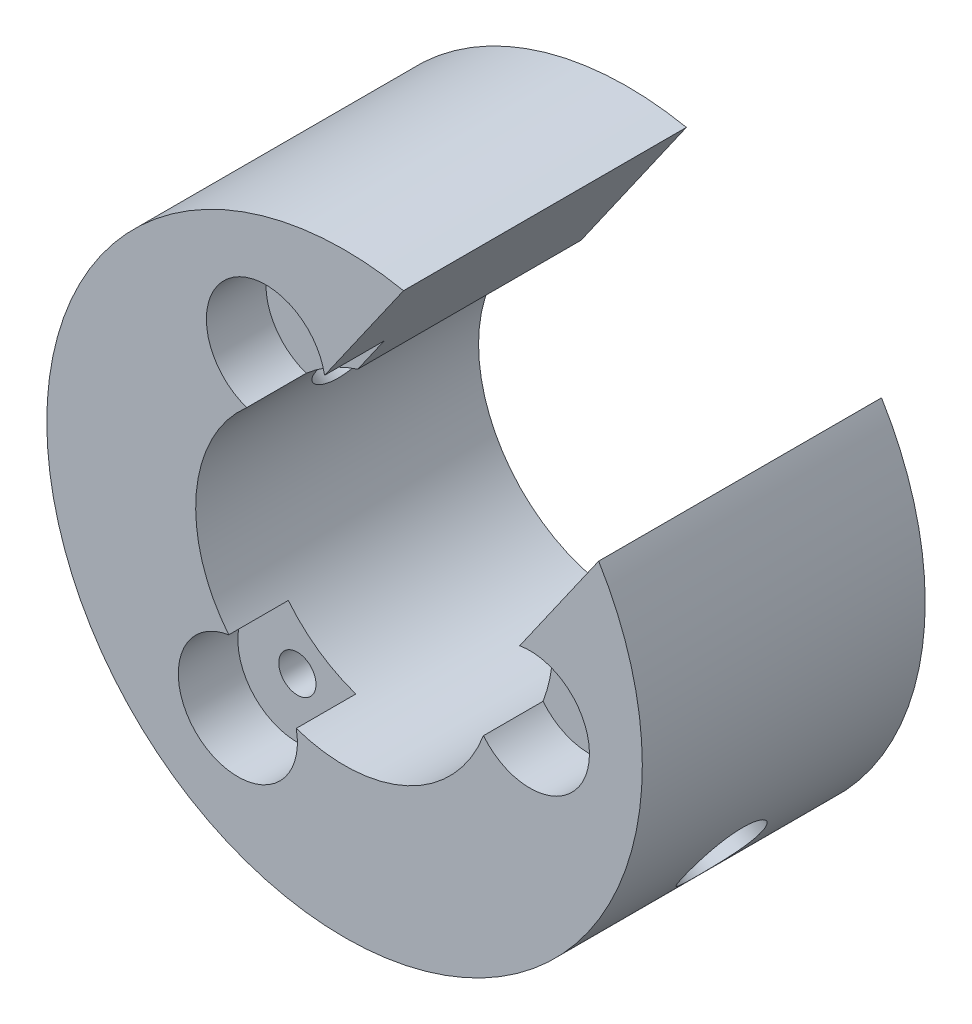
ISO-10303-21;
HEADER;
FILE_DESCRIPTION(('STEP AP214'),'2;1');
FILE_NAME('part.step','',(''),(''),'','','');
FILE_SCHEMA(('AUTOMOTIVE_DESIGN { 1 0 10303 214 1 1 1 1 }'));
ENDSEC;
DATA;
#1=APPLICATION_CONTEXT('core data for automotive mechanical design processes');
#2=APPLICATION_PROTOCOL_DEFINITION('international standard','automotive_design',2000,#1);
#3=PRODUCT_CONTEXT('',#1,'mechanical');
#4=PRODUCT('Part','Part','',(#3));
#5=PRODUCT_RELATED_PRODUCT_CATEGORY('part','',(#4));
#6=PRODUCT_DEFINITION_FORMATION('','',#4);
#7=PRODUCT_DEFINITION_CONTEXT('part definition',#1,'design');
#8=PRODUCT_DEFINITION('design','',#6,#7);
#9=PRODUCT_DEFINITION_SHAPE('','',#8);
#10=(LENGTH_UNIT() NAMED_UNIT(*) SI_UNIT(.MILLI.,.METRE.));
#11=(NAMED_UNIT(*) PLANE_ANGLE_UNIT() SI_UNIT($,.RADIAN.));
#12=(NAMED_UNIT(*) SI_UNIT($,.STERADIAN.) SOLID_ANGLE_UNIT());
#13=UNCERTAINTY_MEASURE_WITH_UNIT(LENGTH_MEASURE(1.E-05),#10,'distance_accuracy_value','');
#14=(GEOMETRIC_REPRESENTATION_CONTEXT(3) GLOBAL_UNCERTAINTY_ASSIGNED_CONTEXT((#13)) GLOBAL_UNIT_ASSIGNED_CONTEXT((#10,
#11,#12)) REPRESENTATION_CONTEXT('',''));
#15=CARTESIAN_POINT('',(0.,0.,0.));
#16=DIRECTION('',(0.,0.,1.));
#17=DIRECTION('',(1.,0.,0.));
#18=AXIS2_PLACEMENT_3D('',#15,#16,#17);
#19=CARTESIAN_POINT('',(-11.1146575850265,3.6588518709451,9.5));
#20=DIRECTION('',(0.,0.,-1.));
#21=DIRECTION('',(-1.,0.,0.));
#22=AXIS2_PLACEMENT_3D('',#19,#20,#21);
#23=CYLINDRICAL_SURFACE('',#22,0.625000000000001);
#24=CARTESIAN_POINT('',(-11.1146575850265,3.6588518709451,0.));
#25=DIRECTION('',(0.,0.,1.));
#26=DIRECTION('',(1.,0.,0.));
#27=AXIS2_PLACEMENT_3D('',#24,#25,#26);
#28=CIRCLE('',#27,0.625000000000001);
#29=CARTESIAN_POINT('',(-10.4896575850265,3.6588518709451,0.));
#30=VERTEX_POINT('',#29);
#31=EDGE_CURVE('E143',#30,#30,#28,.T.);
#32=ORIENTED_EDGE('',*,*,#31,.F.);
#33=EDGE_LOOP('',(#32));
#34=FACE_BOUND('',#33,.T.);
#35=CARTESIAN_POINT('',(-11.1146575850265,3.6588518709451,7.5));
#36=DIRECTION('',(0.,0.,1.));
#37=DIRECTION('',(1.,0.,0.));
#38=AXIS2_PLACEMENT_3D('',#35,#36,#37);
#39=CIRCLE('',#38,0.625000000000001);
#40=CARTESIAN_POINT('',(-10.4896575850265,3.6588518709451,7.5));
#41=VERTEX_POINT('',#40);
#42=EDGE_CURVE('E232',#41,#41,#39,.T.);
#43=ORIENTED_EDGE('',*,*,#42,.T.);
#44=EDGE_LOOP('',(#43));
#45=FACE_BOUND('',#44,.T.);
#46=ADVANCED_FACE('F36',(#34,#45),#23,.F.);
#47=CARTESIAN_POINT('',(-2.24934668680939,-2.54870564855913,9.5));
#48=DIRECTION('',(0.,0.,-1.));
#49=DIRECTION('',(-1.,0.,0.));
#50=AXIS2_PLACEMENT_3D('',#47,#48,#49);
#51=CYLINDRICAL_SURFACE('',#50,0.625);
#52=CARTESIAN_POINT('',(-2.24934668680939,-2.54870564855913,0.));
#53=DIRECTION('',(0.,0.,1.));
#54=DIRECTION('',(1.,0.,0.));
#55=AXIS2_PLACEMENT_3D('',#52,#53,#54);
#56=CIRCLE('',#55,0.625);
#57=CARTESIAN_POINT('',(-1.62434668680939,-2.54870564855913,0.));
#58=VERTEX_POINT('',#57);
#59=EDGE_CURVE('E217',#58,#58,#56,.T.);
#60=ORIENTED_EDGE('',*,*,#59,.F.);
#61=EDGE_LOOP('',(#60));
#62=FACE_BOUND('',#61,.T.);
#63=CARTESIAN_POINT('',(-2.24934668680939,-2.54870564855913,7.5));
#64=DIRECTION('',(0.,0.,1.));
#65=DIRECTION('',(1.,0.,0.));
#66=AXIS2_PLACEMENT_3D('',#63,#64,#65);
#67=CIRCLE('',#66,0.625);
#68=CARTESIAN_POINT('',(-1.62434668680939,-2.54870564855913,7.5));
#69=VERTEX_POINT('',#68);
#70=EDGE_CURVE('E242',#69,#69,#67,.T.);
#71=ORIENTED_EDGE('',*,*,#70,.T.);
#72=EDGE_LOOP('',(#71));
#73=FACE_BOUND('',#72,.T.);
#74=ADVANCED_FACE('F228',(#62,#73),#51,.F.);
#75=CARTESIAN_POINT('',(-12.0579046432617,-7.12251133911001,9.5));
#76=DIRECTION('',(0.,0.,-1.));
#77=DIRECTION('',(-1.,0.,0.));
#78=AXIS2_PLACEMENT_3D('',#75,#76,#77);
#79=CYLINDRICAL_SURFACE('',#78,0.625000000000001);
#80=CARTESIAN_POINT('',(-12.0579046432617,-7.12251133911001,0.));
#81=DIRECTION('',(0.,0.,1.));
#82=DIRECTION('',(1.,0.,0.));
#83=AXIS2_PLACEMENT_3D('',#80,#81,#82);
#84=CIRCLE('',#83,0.625000000000001);
#85=CARTESIAN_POINT('',(-11.4329046432617,-7.12251133911001,0.));
#86=VERTEX_POINT('',#85);
#87=EDGE_CURVE('E215',#86,#86,#84,.T.);
#88=ORIENTED_EDGE('',*,*,#87,.F.);
#89=EDGE_LOOP('',(#88));
#90=FACE_BOUND('',#89,.T.);
#91=CARTESIAN_POINT('',(-12.0579046432617,-7.12251133911001,7.5));
#92=DIRECTION('',(0.,0.,1.));
#93=DIRECTION('',(1.,0.,0.));
#94=AXIS2_PLACEMENT_3D('',#91,#92,#93);
#95=CIRCLE('',#94,0.625000000000001);
#96=CARTESIAN_POINT('',(-11.4329046432617,-7.12251133911001,7.5));
#97=VERTEX_POINT('',#96);
#98=EDGE_CURVE('E258',#97,#97,#95,.T.);
#99=ORIENTED_EDGE('',*,*,#98,.T.);
#100=EDGE_LOOP('',(#99));
#101=FACE_BOUND('',#100,.T.);
#102=ADVANCED_FACE('F195',(#90,#101),#79,.F.);
#103=CARTESIAN_POINT('',(-8.47396963836586,-2.00412170557468,9.5));
#104=DIRECTION('',(0.,0.,1.));
#105=DIRECTION('',(1.,0.,0.));
#106=AXIS2_PLACEMENT_3D('',#103,#104,#105);
#107=PLANE('',#106);
#108=CARTESIAN_POINT('',(-11.1146575850265,3.6588518709451,9.5));
#109=DIRECTION('',(0.,0.,1.));
#110=DIRECTION('',(1.,0.,0.));
#111=AXIS2_PLACEMENT_3D('',#108,#109,#110);
#112=CIRCLE('',#111,2.);
#113=CARTESIAN_POINT('',(-9.14576767615636,4.01023844830594,9.5));
#114=VERTEX_POINT('',#113);
#115=CARTESIAN_POINT('',(-11.7588478901553,1.76543727007764,9.5));
#116=VERTEX_POINT('',#115);
#117=EDGE_CURVE('E254',#114,#116,#112,.T.);
#118=ORIENTED_EDGE('',*,*,#117,.F.);
#119=DIRECTION('',(0.573576436351047,0.819152044288991,0.));
#120=VECTOR('',#119,1.);
#121=CARTESIAN_POINT('',(-10.0298485064687,2.74764017269648,9.5));
#122=LINE('',#121,#120);
#123=CARTESIAN_POINT('',(-6.49366294267844,7.79783653709375,9.5));
#124=VERTEX_POINT('',#123);
#125=EDGE_CURVE('E136',#114,#124,#122,.T.);
#126=ORIENTED_EDGE('',*,*,#125,.T.);
#127=CARTESIAN_POINT('',(-8.47396963836586,-2.00412170557468,9.5));
#128=DIRECTION('',(0.,0.,1.));
#129=DIRECTION('',(1.,0.,0.));
#130=AXIS2_PLACEMENT_3D('',#127,#128,#129);
#131=CIRCLE('',#130,10.);
#132=CARTESIAN_POINT('',(0.0595534116334959,3.20922504628537,9.5));
#133=VERTEX_POINT('',#132);
#134=EDGE_CURVE('E139',#124,#133,#131,.T.);
#135=ORIENTED_EDGE('',*,*,#134,.T.);
#136=DIRECTION('',(-0.573576436351048,-0.819152044288991,0.));
#137=VECTOR('',#136,1.);
#138=CARTESIAN_POINT('',(-3.47663215215675,-1.84097131811189,9.5));
#139=LINE('',#138,#137);
#140=CARTESIAN_POINT('',(-2.59255132184436,-0.578373042502342,9.5));
#141=VERTEX_POINT('',#140);
#142=EDGE_CURVE('E147',#133,#141,#139,.T.);
#143=ORIENTED_EDGE('',*,*,#142,.T.);
#144=CARTESIAN_POINT('',(-2.24934668680939,-2.54870564855913,9.5));
#145=DIRECTION('',(0.,0.,1.));
#146=DIRECTION('',(1.,0.,0.));
#147=AXIS2_PLACEMENT_3D('',#144,#145,#146);
#148=CIRCLE('',#147,2.);
#149=CARTESIAN_POINT('',(-3.80824835484368,-3.80163245783408,9.5));
#150=VERTEX_POINT('',#149);
#151=EDGE_CURVE('E135',#150,#141,#148,.T.);
#152=ORIENTED_EDGE('',*,*,#151,.F.);
#153=CARTESIAN_POINT('',(-8.47396963836586,-2.00412170557468,9.5));
#154=DIRECTION('',(0.,0.,-1.));
#155=DIRECTION('',(1.,0.,0.));
#156=AXIS2_PLACEMENT_3D('',#153,#154,#155);
#157=CIRCLE('',#156,5.);
#158=CARTESIAN_POINT('',(-10.0960643464498,-6.73368920778947,9.5));
#159=VERTEX_POINT('',#158);
#160=EDGE_CURVE('E128',#150,#159,#157,.T.);
#161=ORIENTED_EDGE('',*,*,#160,.T.);
#162=CARTESIAN_POINT('',(-12.0579046432617,-7.12251133911001,9.5));
#163=DIRECTION('',(0.,0.,1.));
#164=DIRECTION('',(1.,0.,0.));
#165=AXIS2_PLACEMENT_3D('',#162,#163,#164);
#166=CIRCLE('',#165,2.);
#167=CARTESIAN_POINT('',(-12.3635202551593,-5.1459994879529,9.5));
#168=VERTEX_POINT('',#167);
#169=EDGE_CURVE('E114',#168,#159,#166,.T.);
#170=ORIENTED_EDGE('',*,*,#169,.F.);
#171=EDGE_CURVE('E137',#168,#116,#157,.T.);
#172=ORIENTED_EDGE('',*,*,#171,.T.);
#173=EDGE_LOOP('',(#118,#126,#135,#143,#152,#161,#170,#172));
#174=FACE_BOUND('',#173,.T.);
#175=ADVANCED_FACE('F133',(#174),#107,.T.);
#176=CARTESIAN_POINT('',(-8.47396963836586,-2.00412170557468,0.));
#177=DIRECTION('',(0.,0.,1.));
#178=DIRECTION('',(1.,0.,0.));
#179=AXIS2_PLACEMENT_3D('',#176,#177,#178);
#180=PLANE('',#179);
#181=CARTESIAN_POINT('',(-8.47396963836586,-2.00412170557468,0.));
#182=DIRECTION('',(0.,0.,-1.));
#183=DIRECTION('',(1.,0.,0.));
#184=AXIS2_PLACEMENT_3D('',#181,#182,#183);
#185=CIRCLE('',#184,5.);
#186=CARTESIAN_POINT('',(-3.47663215215675,-1.84097131811189,0.));
#187=VERTEX_POINT('',#186);
#188=CARTESIAN_POINT('',(-10.0298485064687,2.74764017269648,0.));
#189=VERTEX_POINT('',#188);
#190=EDGE_CURVE('E150',#187,#189,#185,.T.);
#191=ORIENTED_EDGE('',*,*,#190,.F.);
#192=DIRECTION('',(-0.573576436351048,-0.819152044288991,0.));
#193=VECTOR('',#192,1.);
#194=CARTESIAN_POINT('',(-3.47663215215675,-1.84097131811189,0.));
#195=LINE('',#194,#193);
#196=CARTESIAN_POINT('',(0.0595534116334959,3.20922504628537,0.));
#197=VERTEX_POINT('',#196);
#198=EDGE_CURVE('E141',#197,#187,#195,.T.);
#199=ORIENTED_EDGE('',*,*,#198,.F.);
#200=CARTESIAN_POINT('',(-8.47396963836586,-2.00412170557468,0.));
#201=DIRECTION('',(0.,0.,1.));
#202=DIRECTION('',(1.,0.,0.));
#203=AXIS2_PLACEMENT_3D('',#200,#201,#202);
#204=CIRCLE('',#203,10.);
#205=CARTESIAN_POINT('',(-6.49366294267844,7.79783653709375,0.));
#206=VERTEX_POINT('',#205);
#207=EDGE_CURVE('E155',#206,#197,#204,.T.);
#208=ORIENTED_EDGE('',*,*,#207,.F.);
#209=DIRECTION('',(0.573576436351047,0.819152044288991,0.));
#210=VECTOR('',#209,1.);
#211=CARTESIAN_POINT('',(-10.0298485064687,2.74764017269648,0.));
#212=LINE('',#211,#210);
#213=EDGE_CURVE('E153',#189,#206,#212,.T.);
#214=ORIENTED_EDGE('',*,*,#213,.F.);
#215=EDGE_LOOP('',(#191,#199,#208,#214));
#216=FACE_BOUND('',#215,.T.);
#217=ORIENTED_EDGE('',*,*,#31,.T.);
#218=EDGE_LOOP('',(#217));
#219=FACE_BOUND('',#218,.T.);
#220=ORIENTED_EDGE('',*,*,#59,.T.);
#221=EDGE_LOOP('',(#220));
#222=FACE_BOUND('',#221,.T.);
#223=ORIENTED_EDGE('',*,*,#87,.T.);
#224=EDGE_LOOP('',(#223));
#225=FACE_BOUND('',#224,.T.);
#226=ADVANCED_FACE('F224',(#216,#219,#222,#225),#180,.F.);
#227=CARTESIAN_POINT('',(-8.47396963836586,-2.00412170557468,9.5));
#228=DIRECTION('',(0.,0.,-1.));
#229=DIRECTION('',(-1.,0.,0.));
#230=AXIS2_PLACEMENT_3D('',#227,#228,#229);
#231=CYLINDRICAL_SURFACE('',#230,5.);
#232=CARTESIAN_POINT('',(-8.47396963836586,-2.00412170557468,7.5));
#233=DIRECTION('',(0.,0.,1.));
#234=DIRECTION('',(1.,0.,0.));
#235=AXIS2_PLACEMENT_3D('',#232,#233,#234);
#236=CIRCLE('',#235,5.);
#237=CARTESIAN_POINT('',(-11.7588478901553,1.76543727007764,7.5));
#238=VERTEX_POINT('',#237);
#239=CARTESIAN_POINT('',(-10.0298485064687,2.74764017269648,7.5));
#240=VERTEX_POINT('',#239);
#241=EDGE_CURVE('E59',#238,#240,#236,.F.);
#242=ORIENTED_EDGE('',*,*,#241,.F.);
#243=DIRECTION('',(0.,0.,1.));
#244=VECTOR('',#243,1.);
#245=CARTESIAN_POINT('',(-11.7588478901553,1.76543727007764,8.5));
#246=LINE('',#245,#244);
#247=EDGE_CURVE('E178',#238,#116,#246,.T.);
#248=ORIENTED_EDGE('',*,*,#247,.T.);
#249=ORIENTED_EDGE('',*,*,#171,.F.);
#250=DIRECTION('',(0.,0.,1.));
#251=VECTOR('',#250,1.);
#252=CARTESIAN_POINT('',(-12.3635202551593,-5.1459994879529,8.5));
#253=LINE('',#252,#251);
#254=CARTESIAN_POINT('',(-12.3635202551593,-5.1459994879529,7.5));
#255=VERTEX_POINT('',#254);
#256=EDGE_CURVE('E11',#168,#255,#253,.F.);
#257=ORIENTED_EDGE('',*,*,#256,.T.);
#258=CARTESIAN_POINT('',(-8.47396963836586,-2.00412170557468,7.5));
#259=DIRECTION('',(0.,0.,1.));
#260=DIRECTION('',(1.,0.,0.));
#261=AXIS2_PLACEMENT_3D('',#258,#259,#260);
#262=CIRCLE('',#261,5.);
#263=CARTESIAN_POINT('',(-10.0960643464498,-6.73368920778947,7.5));
#264=VERTEX_POINT('',#263);
#265=EDGE_CURVE('E129',#264,#255,#262,.F.);
#266=ORIENTED_EDGE('',*,*,#265,.F.);
#267=DIRECTION('',(0.,0.,1.));
#268=VECTOR('',#267,1.);
#269=CARTESIAN_POINT('',(-10.0960643464498,-6.73368920778947,8.5));
#270=LINE('',#269,#268);
#271=EDGE_CURVE('E45',#264,#159,#270,.T.);
#272=ORIENTED_EDGE('',*,*,#271,.T.);
#273=ORIENTED_EDGE('',*,*,#160,.F.);
#274=DIRECTION('',(0.,0.,1.));
#275=VECTOR('',#274,1.);
#276=CARTESIAN_POINT('',(-3.80824835484368,-3.80163245783408,8.5));
#277=LINE('',#276,#275);
#278=CARTESIAN_POINT('',(-3.80824835484368,-3.80163245783408,7.5));
#279=VERTEX_POINT('',#278);
#280=EDGE_CURVE('E266',#150,#279,#277,.F.);
#281=ORIENTED_EDGE('',*,*,#280,.T.);
#282=CARTESIAN_POINT('',(-8.47396963836586,-2.00412170557468,7.5));
#283=DIRECTION('',(0.,0.,1.));
#284=DIRECTION('',(1.,0.,0.));
#285=AXIS2_PLACEMENT_3D('',#282,#283,#284);
#286=CIRCLE('',#285,5.);
#287=CARTESIAN_POINT('',(-3.47663215215675,-1.84097131811189,7.5));
#288=VERTEX_POINT('',#287);
#289=EDGE_CURVE('E235',#288,#279,#286,.F.);
#290=ORIENTED_EDGE('',*,*,#289,.F.);
#291=DIRECTION('',(0.,0.,-1.));
#292=VECTOR('',#291,1.);
#293=CARTESIAN_POINT('',(-3.47663215215675,-1.84097131811189,9.5));
#294=LINE('',#293,#292);
#295=EDGE_CURVE('E149',#288,#187,#294,.T.);
#296=ORIENTED_EDGE('',*,*,#295,.T.);
#297=ORIENTED_EDGE('',*,*,#190,.T.);
#298=DIRECTION('',(0.,0.,-1.));
#299=VECTOR('',#298,1.);
#300=CARTESIAN_POINT('',(-10.0298485064687,2.74764017269648,9.5));
#301=LINE('',#300,#299);
#302=EDGE_CURVE('E166',#240,#189,#301,.T.);
#303=ORIENTED_EDGE('',*,*,#302,.F.);
#304=EDGE_LOOP('',(#242,#248,#249,#257,#266,#272,#273,#281,#290,#296,#297,#303));
#305=FACE_BOUND('',#304,.T.);
#306=CARTESIAN_POINT('',(-5.29838923122384,-5.86620522069651,5.));
#307=CARTESIAN_POINT('',(-5.29838714564742,-5.86620448856514,4.92703496319355));
#308=CARTESIAN_POINT('',(-5.29352968475595,-5.86222505025176,4.85405086530433));
#309=CARTESIAN_POINT('',(-5.27438332858797,-5.84636022819014,4.71019060146453));
#310=CARTESIAN_POINT('',(-5.26008961315466,-5.83447080389803,4.63931553217917));
#311=CARTESIAN_POINT('',(-5.22291511822317,-5.80296793431709,4.50177658833933));
#312=CARTESIAN_POINT('',(-5.2000465480373,-5.78336546929625,4.43510688290837));
#313=CARTESIAN_POINT('',(-5.1469150755666,-5.73667493211746,4.30759893659446));
#314=CARTESIAN_POINT('',(-5.11665160705032,-5.70958628671772,4.24676114276111));
#315=CARTESIAN_POINT('',(-5.04939167734034,-5.64752694049097,4.13110454928685));
#316=CARTESIAN_POINT('',(-5.01225715933871,-5.61239026690903,4.07645506351549));
#317=CARTESIAN_POINT('',(-4.93339463853676,-5.5350386764492,3.97622168317895));
#318=CARTESIAN_POINT('',(-4.89166614221803,-5.4928229988381,3.93063876408924));
#319=CARTESIAN_POINT('',(-4.80462038511181,-5.40116897573278,3.84910432088916));
#320=CARTESIAN_POINT('',(-4.75925492834435,-5.35162204651443,3.81332585254648));
#321=CARTESIAN_POINT('',(-4.66740490036721,-5.24679249052545,3.75353998986359));
#322=CARTESIAN_POINT('',(-4.62092051467772,-5.19151080962343,3.72953065809402));
#323=CARTESIAN_POINT('',(-4.52965967956613,-5.07781830313664,3.69450193343303));
#324=CARTESIAN_POINT('',(-4.48486833011105,-5.01950580831443,3.68320255172695));
#325=CARTESIAN_POINT('',(-4.39745468262337,-4.90023777480887,3.6730394413144));
#326=CARTESIAN_POINT('',(-4.35483201761469,-4.83928268654935,3.67417360157586));
#327=CARTESIAN_POINT('',(-4.27406218367964,-4.71814916417466,3.68864782217309));
#328=CARTESIAN_POINT('',(-4.2358284905882,-4.65799067759233,3.70167528446225));
#329=CARTESIAN_POINT('',(-4.16345554977089,-4.53874901384521,3.73906676362766));
#330=CARTESIAN_POINT('',(-4.12931651749227,-4.47966589340118,3.76343137669774));
#331=CARTESIAN_POINT('',(-4.06535469070389,-4.36389535166615,3.82301743662541));
#332=CARTESIAN_POINT('',(-4.03557373231377,-4.30723443512576,3.85833509606499));
#333=CARTESIAN_POINT('',(-3.9809107695705,-4.19868788939448,3.9387510440094));
#334=CARTESIAN_POINT('',(-3.95602969680174,-4.14680316926841,3.98385118897797));
#335=CARTESIAN_POINT('',(-3.91048723274055,-4.04805832698805,4.08415004613277));
#336=CARTESIAN_POINT('',(-3.88997491580269,-4.00139576857859,4.13961124287636));
#337=CARTESIAN_POINT('',(-3.85398885290763,-3.91668585530161,4.25822514820975));
#338=CARTESIAN_POINT('',(-3.83851541659706,-3.87863902992728,4.32137832915575));
#339=CARTESIAN_POINT('',(-3.81231270593906,-3.81250056733465,4.45415107942852));
#340=CARTESIAN_POINT('',(-3.80161497074862,-3.78447534848839,4.52381006724654));
#341=CARTESIAN_POINT('',(-3.78491959207021,-3.74003053817499,4.66726846303903));
#342=CARTESIAN_POINT('',(-3.77892083511713,-3.72360819739209,4.74106688569302));
#343=CARTESIAN_POINT('',(-3.77159893524941,-3.70348102227876,4.88844636074045));
#344=CARTESIAN_POINT('',(-3.7701469001003,-3.69942569233916,4.96197319512024));
#345=CARTESIAN_POINT('',(-3.77152303027396,-3.70323917346713,5.10867121104519));
#346=CARTESIAN_POINT('',(-3.77435075529879,-3.7111067579159,5.18184242839899));
#347=CARTESIAN_POINT('',(-3.78425189925713,-3.73811878715665,5.32434981371186));
#348=CARTESIAN_POINT('',(-3.7912456706828,-3.75705156001614,5.39373192200024));
#349=CARTESIAN_POINT('',(-3.80954311483963,-3.80517239415266,5.52823810347138));
#350=CARTESIAN_POINT('',(-3.82084733771424,-3.83436176444312,5.59336163188765));
#351=CARTESIAN_POINT('',(-3.84823235857171,-3.90252285600864,5.71902836079741));
#352=CARTESIAN_POINT('',(-3.86440947766867,-3.94168911922689,5.77944495287208));
#353=CARTESIAN_POINT('',(-3.90163912086156,-4.02797872927655,5.89261439091126));
#354=CARTESIAN_POINT('',(-3.92269252735861,-4.07510351584449,5.9453658469964));
#355=CARTESIAN_POINT('',(-3.97045591996701,-4.17704906567907,6.04320288036611));
#356=CARTESIAN_POINT('',(-3.99730605526488,-4.23204641406451,6.08803654189961));
#357=CARTESIAN_POINT('',(-4.05625825560757,-4.34676522965187,6.16691870389619));
#358=CARTESIAN_POINT('',(-4.08836001923564,-4.40648642562743,6.20096782300804));
#359=CARTESIAN_POINT('',(-4.15722149289233,-4.52811159446704,6.25699044372927));
#360=CARTESIAN_POINT('',(-4.1939415079897,-4.5899940540602,6.2790592108142));
#361=CARTESIAN_POINT('',(-4.27156195564284,-4.71431229856665,6.31078443852255));
#362=CARTESIAN_POINT('',(-4.3124614828715,-4.7767479609855,6.32044358107716));
#363=CARTESIAN_POINT('',(-4.39610055964506,-4.89829945724046,6.32691417059225));
#364=CARTESIAN_POINT('',(-4.43874833078391,-4.95745871668458,6.3241016924509));
#365=CARTESIAN_POINT('',(-4.52569057738377,-5.0727214149298,6.30658643267746));
#366=CARTESIAN_POINT('',(-4.56998499946493,-5.12882495264378,6.29188403616325));
#367=CARTESIAN_POINT('',(-4.65846050544218,-5.23625855561694,6.25120749260255));
#368=CARTESIAN_POINT('',(-4.70264070362084,-5.287614956726,6.22530070971095));
#369=CARTESIAN_POINT('',(-4.78958558215025,-5.38488713779572,6.16301890903153));
#370=CARTESIAN_POINT('',(-4.8323500601058,-5.43080214223946,6.12664240160809));
#371=CARTESIAN_POINT('',(-4.91598290830097,-5.51759053073863,6.0433096488844));
#372=CARTESIAN_POINT('',(-4.95676909810883,-5.55829465847704,5.99609465818453));
#373=CARTESIAN_POINT('',(-5.03348115302541,-5.63260588122969,5.89291656165132));
#374=CARTESIAN_POINT('',(-5.06940573493071,-5.66621110382207,5.83695115454684));
#375=CARTESIAN_POINT('',(-5.13547273712986,-5.72655206861673,5.7164081320078));
#376=CARTESIAN_POINT('',(-5.16547407198879,-5.7531243982111,5.65167108624029));
#377=CARTESIAN_POINT('',(-5.21712463367358,-5.7980828337171,5.51631779501645));
#378=CARTESIAN_POINT('',(-5.23877945567199,-5.81647442495106,5.44570552682005));
#379=CARTESIAN_POINT('',(-5.26968686220092,-5.84246847526998,5.31277884561733));
#380=CARTESIAN_POINT('',(-5.28040791530468,-5.8513608985398,5.25105163002842));
#381=CARTESIAN_POINT('',(-5.29475959953924,-5.86322925219635,5.12622092604089));
#382=CARTESIAN_POINT('',(-5.29839103532856,-5.86620585401862,5.06311759465104));
#383=CARTESIAN_POINT('',(-5.29838923122384,-5.86620522069651,5.));
#384=B_SPLINE_CURVE_WITH_KNOTS('',3,(#306,#307,#308,#309,#310,#311,#312,#313,#314,#315,#316,
#317,#318,#319,#320,#321,#322,#323,#324,#325,#326,#327,#328,#329,#330,#331,#332,#333,#334,#335,
#336,#337,#338,#339,#340,#341,#342,#343,#344,#345,#346,#347,#348,#349,#350,#351,#352,#353,#354,
#355,#356,#357,#358,#359,#360,#361,#362,#363,#364,#365,#366,#367,#368,#369,#370,#371,#372,#373,
#374,#375,#376,#377,#378,#379,#380,#381,#382,#383),.UNSPECIFIED.,.T.,.F.,(4,2,2,2,2,2,2,2,2,2,2,
2,2,2,2,2,2,2,2,2,2,2,2,2,2,2,2,2,2,2,2,2,2,2,2,2,2,2,4),(0.,0.218662890645732,0.43743756354583,
0.655901909620422,0.874382988875601,1.09785673499746,1.32135451175684,1.54857465767534,
1.77575738615557,1.99783098467358,2.21986687895385,2.43622981195207,2.65260412424942,
2.87093566349019,3.08930867274067,3.31423634856626,3.53917784392101,3.76558365823512,
3.99193580741449,4.21181029263951,4.43166215890906,4.64743997455115,4.86324533916458,
5.08363272298283,5.30406001876825,5.53057430741321,5.75707559984849,5.98174838449336,
6.20637260535093,6.42427023356095,6.64216080428668,6.85875917607042,7.07538838078456,
7.2978567934837,7.52038381184438,7.74770010566301,7.9748637494805,8.16403712637631,
8.35318903119358),.UNSPECIFIED.);
#385=CARTESIAN_POINT('',(-5.29838923122384,-5.86620522069651,5.));
#386=VERTEX_POINT('',#385);
#387=EDGE_CURVE('E208',#386,#386,#384,.T.);
#388=ORIENTED_EDGE('',*,*,#387,.T.);
#389=EDGE_LOOP('',(#388));
#390=FACE_BOUND('',#389,.T.);
#391=CARTESIAN_POINT('',(-13.1892534843777,-0.340962587648741,5.));
#392=CARTESIAN_POINT('',(-13.1892535097084,-0.340960377444293,5.07296503680645));
#393=CARTESIAN_POINT('',(-13.1871754103607,-0.335034809226522,5.14594913469567));
#394=CARTESIAN_POINT('',(-13.1788157936201,-0.311617030905185,5.28980939853547));
#395=CARTESIAN_POINT('',(-13.1725321279485,-0.294118909388435,5.36068446782083));
#396=CARTESIAN_POINT('',(-13.1556435399543,-0.248411694850632,5.49822341166067));
#397=CARTESIAN_POINT('',(-13.1450447598776,-0.220217830303078,5.56489311709163));
#398=CARTESIAN_POINT('',(-13.1193420404597,-0.154321473473032,5.69240106340554));
#399=CARTESIAN_POINT('',(-13.1042377561099,-0.116618253046782,5.7532388572389));
#400=CARTESIAN_POINT('',(-13.0689252972093,-0.0321890469325645,5.86889545071316));
#401=CARTESIAN_POINT('',(-13.0486083774947,0.0147234357445002,5.92354493648452));
#402=CARTESIAN_POINT('',(-13.0028942294012,0.115285766654205,6.02377831682105));
#403=CARTESIAN_POINT('',(-12.9774964549603,0.168936338828548,6.06936123591076));
#404=CARTESIAN_POINT('',(-12.9211412481043,0.282080116570836,6.15089567911084));
#405=CARTESIAN_POINT('',(-12.8900982643608,0.341655749366408,6.18667414745352));
#406=CARTESIAN_POINT('',(-12.8230052638909,0.463820362639626,6.24646001013641));
#407=CARTESIAN_POINT('',(-12.7869560725386,0.526408845279203,6.27046934190598));
#408=CARTESIAN_POINT('',(-12.7113331070592,0.651051105963992,6.30549806656698));
#409=CARTESIAN_POINT('',(-12.6718568297355,0.713085254358738,6.31679744827305));
#410=CARTESIAN_POINT('',(-12.589678766997,0.836019283772637,6.32696055868561));
#411=CARTESIAN_POINT('',(-12.5469775303554,0.896919355582473,6.32582639842414));
#412=CARTESIAN_POINT('',(-12.460774163429,1.01424827719748,6.31135217782692));
#413=CARTESIAN_POINT('',(-12.4173203707009,1.07075161066404,6.29832471553775));
#414=CARTESIAN_POINT('',(-12.3300228627787,1.17954298001983,6.26093323637234));
#415=CARTESIAN_POINT('',(-12.2861791271974,1.23183079405521,6.23656862330226));
#416=CARTESIAN_POINT('',(-12.1992666365901,1.33153110797735,6.17698256337459));
#417=CARTESIAN_POINT('',(-12.1562084790871,1.37889522961258,6.14166490393501));
#418=CARTESIAN_POINT('',(-12.0729039254037,1.46738671746124,6.0612489559906));
#419=CARTESIAN_POINT('',(-12.0326580648442,1.50851289735322,6.01614881102203));
#420=CARTESIAN_POINT('',(-11.9554447052983,1.58508153987333,5.91584995386722));
#421=CARTESIAN_POINT('',(-11.9186118690729,1.6203163476502,5.86038875712363));
#422=CARTESIAN_POINT('',(-11.8513185470482,1.68310468208393,5.74177485179024));
#423=CARTESIAN_POINT('',(-11.8208584529043,1.71065773667078,5.67862167084425));
#424=CARTESIAN_POINT('',(-11.7676704825107,1.75790091697597,5.54584892057148));
#425=CARTESIAN_POINT('',(-11.744994232088,1.77753868916007,5.47618993275346));
#426=CARTESIAN_POINT('',(-11.7089399276128,1.80842823369887,5.33273153696096));
#427=CARTESIAN_POINT('',(-11.6955596708759,1.81968199268988,5.25893311430698));
#428=CARTESIAN_POINT('',(-11.6791505501868,1.83344622728272,5.11155363925955));
#429=CARTESIAN_POINT('',(-11.6758364118375,1.83619769852463,5.03802680487976));
#430=CARTESIAN_POINT('',(-11.6789492476738,1.83360027179324,4.89132878895481));
#431=CARTESIAN_POINT('',(-11.6853752198054,1.828252207093,4.81815757160101));
#432=CARTESIAN_POINT('',(-11.7073718336797,1.80970951706557,4.67565018628814));
#433=CARTESIAN_POINT('',(-11.7227708099214,1.79666213197845,4.60626807799976));
#434=CARTESIAN_POINT('',(-11.7617315081925,1.76300986413671,4.47176189652862));
#435=CARTESIAN_POINT('',(-11.7852942721321,1.7424040167074,4.40663836811235));
#436=CARTESIAN_POINT('',(-11.8399785181423,1.69335804838109,4.28097163920259));
#437=CARTESIAN_POINT('',(-11.8712498660801,1.66476087798066,4.22055504712792));
#438=CARTESIAN_POINT('',(-11.9396022879934,1.60026367220111,4.10738560908875));
#439=CARTESIAN_POINT('',(-11.9766844130798,1.56436231521727,4.0546341530036));
#440=CARTESIAN_POINT('',(-12.0561458515957,1.48461197607362,3.95679711963389));
#441=CARTESIAN_POINT('',(-12.0986431669134,1.44057090108978,3.9119634581004));
#442=CARTESIAN_POINT('',(-12.1862807513756,1.34593780769932,3.83308129610381));
#443=CARTESIAN_POINT('',(-12.2314208687412,1.29534616529667,3.79903217699196));
#444=CARTESIAN_POINT('',(-12.322159131312,1.1890392889665,3.74300955627073));
#445=CARTESIAN_POINT('',(-12.3677506371212,1.13336871404496,3.7209407891858));
#446=CARTESIAN_POINT('',(-12.4580238174817,1.01791000835911,3.68921556147745));
#447=CARTESIAN_POINT('',(-12.5027056865658,0.958122770219575,3.67955641892284));
#448=CARTESIAN_POINT('',(-12.5883204816164,0.837954686795551,3.67308582940775));
#449=CARTESIAN_POINT('',(-12.6293256043697,0.77764523256928,3.6758983075491));
#450=CARTESIAN_POINT('',(-12.7079011117195,0.656524080430917,3.69341356732254));
#451=CARTESIAN_POINT('',(-12.7454716075206,0.595712398849258,3.70811596383675));
#452=CARTESIAN_POINT('',(-12.8161657662238,0.47582816247526,3.74879250739745));
#453=CARTESIAN_POINT('',(-12.8493144796628,0.416747432593908,3.77469929028906));
#454=CARTESIAN_POINT('',(-12.9109835306057,0.301776926513623,3.83698109096847));
#455=CARTESIAN_POINT('',(-12.9395032085853,0.245887605746383,3.87335759839191));
#456=CARTESIAN_POINT('',(-12.9924534981014,0.137615058368579,3.95669035111561));
#457=CARTESIAN_POINT('',(-13.0167531680889,0.0853669451731257,4.00390534181547));
#458=CARTESIAN_POINT('',(-13.0603458077338,-0.0121347418138739,4.10708343834868));
#459=CARTESIAN_POINT('',(-13.0796374567715,-0.0573864693826379,4.16304884545316));
#460=CARTESIAN_POINT('',(-13.1137431705589,-0.140106969254106,4.2835918679922));
#461=CARTESIAN_POINT('',(-13.1284519317475,-0.177387274211136,4.34832891375972));
#462=CARTESIAN_POINT('',(-13.1530335093242,-0.241299616441239,4.48368220498355));
#463=CARTESIAN_POINT('',(-13.1629095665677,-0.267938787547399,4.55429447317995));
#464=CARTESIAN_POINT('',(-13.1767650282259,-0.305872738205963,4.68722115438267));
#465=CARTESIAN_POINT('',(-13.1814543566343,-0.318988620575876,4.74894836997159));
#466=CARTESIAN_POINT('',(-13.1876983958874,-0.336534008365597,4.87377907395911));
#467=CARTESIAN_POINT('',(-13.1892534624656,-0.340964499561551,4.93688240534896));
#468=CARTESIAN_POINT('',(-13.1892534843777,-0.340962587648741,5.));
#469=B_SPLINE_CURVE_WITH_KNOTS('',3,(#391,#392,#393,#394,#395,#396,#397,#398,#399,#400,#401,
#402,#403,#404,#405,#406,#407,#408,#409,#410,#411,#412,#413,#414,#415,#416,#417,#418,#419,#420,
#421,#422,#423,#424,#425,#426,#427,#428,#429,#430,#431,#432,#433,#434,#435,#436,#437,#438,#439,
#440,#441,#442,#443,#444,#445,#446,#447,#448,#449,#450,#451,#452,#453,#454,#455,#456,#457,#458,
#459,#460,#461,#462,#463,#464,#465,#466,#467,#468),.UNSPECIFIED.,.T.,.F.,(4,2,2,2,2,2,2,2,2,2,2,
2,2,2,2,2,2,2,2,2,2,2,2,2,2,2,2,2,2,2,2,2,2,2,2,2,2,2,4),(0.,0.218662890645732,0.43743756354583,
0.655901909620422,0.874382988875601,1.09785673499746,1.32135451175685,1.54857465767534,
1.77575738615557,1.99783098467358,2.21986687895385,2.43622981195207,2.65260412424942,
2.87093566349019,3.08930867274068,3.31423634856627,3.53917784392101,3.76558365823512,
3.99193580741449,4.21181029263951,4.43166215890906,4.64743997455115,4.86324533916458,
5.08363272298283,5.30406001876825,5.53057430741322,5.75707559984849,5.98174838449336,
6.20637260535093,6.42427023356095,6.64216080428668,6.85875917607042,7.07538838078456,
7.2978567934837,7.52038381184438,7.74770010566301,7.97486374948051,8.16403712637632,
8.35318903119358),.UNSPECIFIED.);
#470=CARTESIAN_POINT('',(-13.1892534843777,-0.340962587648741,5.));
#471=VERTEX_POINT('',#470);
#472=EDGE_CURVE('E202',#471,#471,#469,.T.);
#473=ORIENTED_EDGE('',*,*,#472,.T.);
#474=EDGE_LOOP('',(#473));
#475=FACE_BOUND('',#474,.T.);
#476=ADVANCED_FACE('F38',(#305,#390,#475),#231,.F.);
#477=CARTESIAN_POINT('',(-10.0298485064687,2.74764017269648,9.5));
#478=DIRECTION('',(-0.819152044288991,0.573576436351047,0.));
#479=DIRECTION('',(-0.573576436351047,-0.819152044288991,0.));
#480=AXIS2_PLACEMENT_3D('',#477,#478,#479);
#481=PLANE('',#480);
#482=ORIENTED_EDGE('',*,*,#125,.F.);
#483=DIRECTION('',(0.,0.,1.));
#484=VECTOR('',#483,1.);
#485=CARTESIAN_POINT('',(-9.14576767615636,4.01023844830594,7.5));
#486=LINE('',#485,#484);
#487=CARTESIAN_POINT('',(-9.14576767615636,4.01023844830594,7.5));
#488=VERTEX_POINT('',#487);
#489=EDGE_CURVE('E130',#114,#488,#486,.F.);
#490=ORIENTED_EDGE('',*,*,#489,.T.);
#491=DIRECTION('',(0.573576436351047,0.819152044288991,0.));
#492=VECTOR('',#491,1.);
#493=CARTESIAN_POINT('',(-10.0298485064687,2.74764017269648,7.5));
#494=LINE('',#493,#492);
#495=EDGE_CURVE('E234',#240,#488,#494,.T.);
#496=ORIENTED_EDGE('',*,*,#495,.F.);
#497=ORIENTED_EDGE('',*,*,#302,.T.);
#498=ORIENTED_EDGE('',*,*,#213,.T.);
#499=DIRECTION('',(0.,0.,-1.));
#500=VECTOR('',#499,1.);
#501=CARTESIAN_POINT('',(-6.49366294267844,7.79783653709375,9.5));
#502=LINE('',#501,#500);
#503=EDGE_CURVE('E163',#124,#206,#502,.T.);
#504=ORIENTED_EDGE('',*,*,#503,.F.);
#505=EDGE_LOOP('',(#482,#490,#496,#497,#498,#504));
#506=FACE_BOUND('',#505,.T.);
#507=ADVANCED_FACE('F248',(#506),#481,.F.);
#508=CARTESIAN_POINT('',(-8.47396963836586,-2.00412170557468,9.5));
#509=DIRECTION('',(0.,0.,-1.));
#510=DIRECTION('',(-1.,0.,0.));
#511=AXIS2_PLACEMENT_3D('',#508,#509,#510);
#512=CYLINDRICAL_SURFACE('',#511,10.);
#513=CARTESIAN_POINT('',(-1.12642090937281,-8.78744888882868,5.));
#514=CARTESIAN_POINT('',(-1.1264181939149,-8.78744697188178,5.07406351412469));
#515=CARTESIAN_POINT('',(-1.12215065017025,-8.78283245103495,5.14817240043896));
#516=CARTESIAN_POINT('',(-1.10525229800312,-8.76445857218816,5.294324712977));
#517=CARTESIAN_POINT('',(-1.09261291280039,-8.75068983582723,5.36636594187663));
#518=CARTESIAN_POINT('',(-1.05952115062099,-8.71430459832247,5.50624556727612));
#519=CARTESIAN_POINT('',(-1.03907432347721,-8.6916943817717,5.57408690950069));
#520=CARTESIAN_POINT('',(-0.991217222774062,-8.63810247452658,5.70371873216698));
#521=CARTESIAN_POINT('',(-0.963808068570622,-8.60712212947407,5.76551018305901));
#522=CARTESIAN_POINT('',(-0.902933541661953,-8.53723474583675,5.8816967451624));
#523=CARTESIAN_POINT('',(-0.86943432135392,-8.49828324461642,5.93604738248073));
#524=CARTESIAN_POINT('',(-0.797761576298231,-8.41340473711479,6.0354253887502));
#525=CARTESIAN_POINT('',(-0.759587806943955,-8.36747736577467,6.0804522694821));
#526=CARTESIAN_POINT('',(-0.679798340470538,-8.26949439972571,6.16007088397533));
#527=CARTESIAN_POINT('',(-0.638169719275026,-8.21741545450641,6.19462095718831));
#528=CARTESIAN_POINT('',(-0.553060618419691,-8.1085437924654,6.25203947142464));
#529=CARTESIAN_POINT('',(-0.509580214947945,-8.05175126948389,6.27490839254483));
#530=CARTESIAN_POINT('',(-0.422469697583489,-7.9352770585663,6.30818462757501));
#531=CARTESIAN_POINT('',(-0.37884194344929,-7.8756141939322,6.31866398411578));
#532=CARTESIAN_POINT('',(-0.292533612016404,-7.75474061866788,6.32708551982217));
#533=CARTESIAN_POINT('',(-0.249852992311833,-7.69352997759958,6.32502826142872));
#534=CARTESIAN_POINT('',(-0.166916530118455,-7.57173021196947,6.30849269824995));
#535=CARTESIAN_POINT('',(-0.126646861036446,-7.51113962179568,6.29409434519753));
#536=CARTESIAN_POINT('',(-0.0492433790964831,-7.391981994947,6.25340897334029));
#537=CARTESIAN_POINT('',(-0.0121096281558938,-7.33341499824058,6.22712171985932));
#538=CARTESIAN_POINT('',(0.0583099553882971,-7.21993245146124,6.16332901321764));
#539=CARTESIAN_POINT('',(0.0915847236530499,-7.16502758366116,6.12579235781336));
#540=CARTESIAN_POINT('',(0.153545271417699,-7.06076783458176,6.04058896110756));
#541=CARTESIAN_POINT('',(0.182230817144522,-7.01141323606885,5.99292170404523));
#542=CARTESIAN_POINT('',(0.234759228625418,-6.91949261413382,5.88837836155191));
#543=CARTESIAN_POINT('',(0.25856353695993,-6.87698117195841,5.83143488773877));
#544=CARTESIAN_POINT('',(0.300728161954078,-6.80063985980351,5.71018659355417));
#545=CARTESIAN_POINT('',(0.319088453502936,-6.76681002986845,5.6458817392299));
#546=CARTESIAN_POINT('',(0.350157405552834,-6.70899842721668,5.5116637607395));
#547=CARTESIAN_POINT('',(0.362862357854062,-6.68502311688465,5.44174699220061));
#548=CARTESIAN_POINT('',(0.382464920917763,-6.64782852225795,5.29833060502474));
#549=CARTESIAN_POINT('',(0.389362839136601,-6.63460866851143,5.22483117629153));
#550=CARTESIAN_POINT('',(0.39725266378018,-6.61947525356111,5.0769151597026));
#551=CARTESIAN_POINT('',(0.398287673865989,-6.61747917679207,5.00250930669718));
#552=CARTESIAN_POINT('',(0.394557091593807,-6.62464649374218,4.85438527444469));
#553=CARTESIAN_POINT('',(0.389791635137111,-6.63380962600806,4.78066707912701));
#554=CARTESIAN_POINT('',(0.374536708645461,-6.66289844668291,4.63629247339724));
#555=CARTESIAN_POINT('',(0.364068732414016,-6.6827837186012,4.56562563462365));
#556=CARTESIAN_POINT('',(0.33753089828581,-6.73257276519979,4.42903257054612));
#557=CARTESIAN_POINT('',(0.321460824051612,-6.76247692677999,4.36310652843717));
#558=CARTESIAN_POINT('',(0.283788797265251,-6.83146205087568,4.23744712602967));
#559=CARTESIAN_POINT('',(0.262155365309321,-6.87059512566624,4.17775181658836));
#560=CARTESIAN_POINT('',(0.213677431942602,-6.95661802353239,4.06663778782664));
#561=CARTESIAN_POINT('',(0.186832708941912,-7.00350817643505,4.01521942062117));
#562=CARTESIAN_POINT('',(0.128148235890775,-7.10382358330069,3.92179440564022));
#563=CARTESIAN_POINT('',(0.0962784645120001,-7.15728765979002,3.87984826830016));
#564=CARTESIAN_POINT('',(0.0282350284413893,-7.26879412738317,3.80697862060714));
#565=CARTESIAN_POINT('',(-0.00793853694545642,-7.32683641283978,3.77605485599164));
#566=CARTESIAN_POINT('',(-0.0837100732462135,-7.44548917183077,3.72621233748978));
#567=CARTESIAN_POINT('',(-0.123297123484097,-7.50609116038536,3.70725680322249));
#568=CARTESIAN_POINT('',(-0.205027456293646,-7.62817612838622,3.6817671947279));
#569=CARTESIAN_POINT('',(-0.24717060996776,-7.68965906328946,3.67523249468721));
#570=CARTESIAN_POINT('',(-0.332531744371377,-7.81122635725664,3.67478141708121));
#571=CARTESIAN_POINT('',(-0.375739209710446,-7.87131777038729,3.68077015698387));
#572=CARTESIAN_POINT('',(-0.462248502139541,-7.98890693409001,3.70499284763228));
#573=CARTESIAN_POINT('',(-0.505550329220645,-8.04640468490727,3.72322679722036));
#574=CARTESIAN_POINT('',(-0.590857814889723,-8.15728708822439,3.77139531437887));
#575=CARTESIAN_POINT('',(-0.632863774888535,-8.21067270157318,3.80132713861544));
#576=CARTESIAN_POINT('',(-0.714178825480083,-8.31204324723797,3.87203138502288));
#577=CARTESIAN_POINT('',(-0.753487865627166,-8.36002807854357,3.91280400990049));
#578=CARTESIAN_POINT('',(-0.82830381657318,-8.44983665094493,4.00439255412032));
#579=CARTESIAN_POINT('',(-0.86378015427978,-8.49161172603358,4.05528117380393));
#580=CARTESIAN_POINT('',(-0.929270493079351,-8.5676604045289,4.16550511157256));
#581=CARTESIAN_POINT('',(-0.959283203736999,-8.60193223615658,4.22484241924183));
#582=CARTESIAN_POINT('',(-1.01277132165215,-8.66236171762034,4.35057285730485));
#583=CARTESIAN_POINT('',(-1.03621832696243,-8.68848416872533,4.41699497675029));
#584=CARTESIAN_POINT('',(-1.07540986036997,-8.73183862211387,4.55477041293822));
#585=CARTESIAN_POINT('',(-1.09116267282444,-8.74908018756654,4.626118331135));
#586=CARTESIAN_POINT('',(-1.11058355637085,-8.77026338809434,4.74818601238055));
#587=CARTESIAN_POINT('',(-1.11651045370506,-8.77670089342884,4.79813920168332));
#588=CARTESIAN_POINT('',(-1.12443004066057,-8.78529427961585,4.89872119154547));
#589=CARTESIAN_POINT('',(-1.12642276640029,-8.7874501997763,4.94934998589804));
#590=CARTESIAN_POINT('',(-1.12642090937281,-8.78744888882868,5.));
#591=B_SPLINE_CURVE_WITH_KNOTS('',3,(#513,#514,#515,#516,#517,#518,#519,#520,#521,#522,#523,
#524,#525,#526,#527,#528,#529,#530,#531,#532,#533,#534,#535,#536,#537,#538,#539,#540,#541,#542,
#543,#544,#545,#546,#547,#548,#549,#550,#551,#552,#553,#554,#555,#556,#557,#558,#559,#560,#561,
#562,#563,#564,#565,#566,#567,#568,#569,#570,#571,#572,#573,#574,#575,#576,#577,#578,#579,#580,
#581,#582,#583,#584,#585,#586,#587,#588,#589,#590),.UNSPECIFIED.,.T.,.F.,(4,2,2,2,2,2,2,2,2,2,2,
2,2,2,2,2,2,2,2,2,2,2,2,2,2,2,2,2,2,2,2,2,2,2,2,2,2,2,4),(0.,0.222005453398648,
0.444238699353734,0.666314266487414,0.888354152384068,1.11166808217374,1.33499370238019,
1.55919606048162,1.78338920309582,2.00627219728927,2.22914519216517,2.4505851253677,
2.67202942978541,2.89409372578062,3.11616933003882,3.33993675456869,3.56370521122003,
3.78762017724724,4.01152328723734,4.23377812040218,4.45602774637581,4.67744541264867,
4.89887163040308,5.12157943223618,5.34429670592817,5.56839884335536,5.79249581089152,
6.01590069512131,6.23929432298353,6.46100156642343,6.68270878890326,6.90436404875493,
7.12602345351939,7.34933752818198,7.57270427839183,7.79702284637654,8.02109935462531,
8.17292421350126,8.32474767851295),.UNSPECIFIED.);
#592=CARTESIAN_POINT('',(-1.12642090937281,-8.78744888882868,5.));
#593=VERTEX_POINT('',#592);
#594=EDGE_CURVE('E177',#593,#593,#591,.T.);
#595=ORIENTED_EDGE('',*,*,#594,.T.);
#596=EDGE_LOOP('',(#595));
#597=FACE_BOUND('',#596,.T.);
#598=CARTESIAN_POINT('',(-17.3612218062287,2.58028108048343,5.));
#599=CARTESIAN_POINT('',(-17.3612209336291,2.58028428781364,4.92593648587531));
#600=CARTESIAN_POINT('',(-17.3583442883641,2.58587272626078,4.85182759956104));
#601=CARTESIAN_POINT('',(-17.3468580668267,2.60803621977231,4.705675287023));
#602=CARTESIAN_POINT('',(-17.3382426112094,2.62462254196216,4.63363405812338));
#603=CARTESIAN_POINT('',(-17.3153697212641,2.66816311083726,4.49375443272388));
#604=CARTESIAN_POINT('',(-17.3011162943673,2.69510999292808,4.42591309049931));
#605=CARTESIAN_POINT('',(-17.2671244670368,2.75841046910811,4.29628126783302));
#606=CARTESIAN_POINT('',(-17.2473869482507,2.7947625511102,4.23448981694099));
#607=CARTESIAN_POINT('',(-17.2025346039789,2.8758687878084,4.1183032548376));
#608=CARTESIAN_POINT('',(-17.1773895738446,2.92066995596407,4.06395261751927));
#609=CARTESIAN_POINT('',(-17.1221433892185,3.01705046490535,3.9645746112498));
#610=CARTESIAN_POINT('',(-17.0920419753439,3.06863016040346,3.9195477305179));
#611=CARTESIAN_POINT('',(-17.0272577099441,3.17711988135652,3.83992911602467));
#612=CARTESIAN_POINT('',(-16.992557336411,3.23405003781559,3.80537904281169));
#613=CARTESIAN_POINT('',(-16.9193604658512,3.35126273330644,3.74796052857536));
#614=CARTESIAN_POINT('',(-16.8808641249169,3.4115451344476,3.72509160745517));
#615=CARTESIAN_POINT('',(-16.80120772004,3.5332387711196,3.69181537242499));
#616=CARTESIAN_POINT('',(-16.7600645371303,3.59464135125434,3.68133601588423));
#617=CARTESIAN_POINT('',(-16.6759997182933,3.71708585095036,3.67291448017783));
#618=CARTESIAN_POINT('',(-16.6330781622364,3.77812778656855,3.67497173857128));
#619=CARTESIAN_POINT('',(-16.5469897619467,3.8977205413836,3.69150730175005));
#620=CARTESIAN_POINT('',(-16.5038262694624,3.95628485459688,3.70590565480247));
#621=CARTESIAN_POINT('',(-16.4183282767894,4.06977464401213,3.74659102665971));
#622=CARTESIAN_POINT('',(-16.3759937929817,4.12470004836079,3.77287828014068));
#623=CARTESIAN_POINT('',(-16.2934399972418,4.22968612829052,3.83667098678236));
#624=CARTESIAN_POINT('',(-16.2532269391359,4.27973275324153,3.87420764218664));
#625=CARTESIAN_POINT('',(-16.176446577708,4.37361555707905,3.95941103889245));
#626=CARTESIAN_POINT('',(-16.1398794601445,4.41745141957893,4.00707829595477));
#627=CARTESIAN_POINT('',(-16.0714681048374,4.49825068451794,4.11162163844809));
#628=CARTESIAN_POINT('',(-16.0396619692746,4.53515918694861,4.16856511226123));
#629=CARTESIAN_POINT('',(-15.9823457526653,4.6008912404387,4.28981340644583));
#630=CARTESIAN_POINT('',(-15.9568357006599,4.62971475420572,4.3541182607701));
#631=CARTESIAN_POINT('',(-15.9131367716853,4.6786827518074,4.4883362392605));
#632=CARTESIAN_POINT('',(-15.8949526990922,4.69882154080834,4.5582530077994));
#633=CARTESIAN_POINT('',(-15.866705684417,4.72996322525296,4.70166939497526));
#634=CARTESIAN_POINT('',(-15.8566423123814,4.74096660437511,4.77516882370847));
#635=CARTESIAN_POINT('',(-15.8451200329807,4.7535565471223,4.9230848402974));
#636=CARTESIAN_POINT('',(-15.8435983286682,4.75521183692501,4.99749069330282));
#637=CARTESIAN_POINT('',(-15.8490574692336,4.74925486952206,5.14561472555531));
#638=CARTESIAN_POINT('',(-15.8560381149068,4.74164282944414,5.21933292087299));
#639=CARTESIAN_POINT('',(-15.8781551728973,4.71735892497292,5.36370752660276));
#640=CARTESIAN_POINT('',(-15.8932609574502,4.7007210814021,5.43437436537635));
#641=CARTESIAN_POINT('',(-15.9309708833028,4.65875481764649,5.57096742945388));
#642=CARTESIAN_POINT('',(-15.9535753141776,4.63342606184344,5.63689347156283));
#643=CARTESIAN_POINT('',(-16.0055155342335,4.5744316342317,5.76255287397033));
#644=CARTESIAN_POINT('',(-16.0348895263447,4.54071855801179,5.82224818341165));
#645=CARTESIAN_POINT('',(-16.0991441789699,4.46574263789867,5.93336221217336));
#646=CARTESIAN_POINT('',(-16.1340250736318,4.42447947297155,5.98478057937883));
#647=CARTESIAN_POINT('',(-16.2082194493307,4.33502421685673,6.07820559435978));
#648=CARTESIAN_POINT('',(-16.2475591437101,4.2867906367623,6.12015173169984));
#649=CARTESIAN_POINT('',(-16.32906872272,4.18471326396588,6.19302137939286));
#650=CARTESIAN_POINT('',(-16.3712385420389,4.13086960071353,6.22394514400836));
#651=CARTESIAN_POINT('',(-16.4568202723931,4.01908601355001,6.27378766251022));
#652=CARTESIAN_POINT('',(-16.5002279452466,3.96115925375152,6.29274319677751));
#653=CARTESIAN_POINT('',(-16.5869968686443,3.84260234486245,6.3182328052721));
#654=CARTESIAN_POINT('',(-16.6303581214173,3.78197233213055,6.32476750531279));
#655=CARTESIAN_POINT('',(-16.715398783064,3.66018064072319,6.3252185829188));
#656=CARTESIAN_POINT('',(-16.7570884170675,3.59902643064961,6.31922984301613));
#657=CARTESIAN_POINT('',(-16.8379981658877,3.47751642430143,6.29500715236772));
#658=CARTESIAN_POINT('',(-16.8772182809379,3.41716062795135,6.27677320277964));
#659=CARTESIAN_POINT('',(-16.9522367786347,3.2990737976955,6.22860468562113));
#660=CARTESIAN_POINT('',(-16.9880359610954,3.2413421519265,6.19867286138456));
#661=CARTESIAN_POINT('',(-17.0554817295638,3.13026023036952,6.12796861497712));
#662=CARTESIAN_POINT('',(-17.0871282379062,3.07691003653253,6.08719599009951));
#663=CARTESIAN_POINT('',(-17.1459321284095,2.97588969870689,5.99560744587968));
#664=CARTESIAN_POINT('',(-17.173054236096,2.92826492878223,5.94471882619608));
#665=CARTESIAN_POINT('',(-17.2221176030359,2.84071396076081,5.83449488842744));
#666=CARTESIAN_POINT('',(-17.2440576387165,2.8007895812607,5.77515758075817));
#667=CARTESIAN_POINT('',(-17.2825487627704,2.72985909164478,5.64942714269515));
#668=CARTESIAN_POINT('',(-17.2990764891938,2.69889170930423,5.58300502324971));
#669=CARTESIAN_POINT('',(-17.326412055248,2.64723561820213,5.44522958706178));
#670=CARTESIAN_POINT('',(-17.3372260479012,2.62653585389475,5.373881668865));
#671=CARTESIAN_POINT('',(-17.3504894117478,2.60104111165643,5.25181398761945));
#672=CARTESIAN_POINT('',(-17.3545115697311,2.59326989347015,5.20186079831668));
#673=CARTESIAN_POINT('',(-17.359878053053,2.58288880487306,5.10127880845453));
#674=CARTESIAN_POINT('',(-17.3612224029757,2.58027888707792,5.05065001410196));
#675=CARTESIAN_POINT('',(-17.3612218062287,2.58028108048343,5.));
#676=B_SPLINE_CURVE_WITH_KNOTS('',3,(#598,#599,#600,#601,#602,#603,#604,#605,#606,#607,#608,
#609,#610,#611,#612,#613,#614,#615,#616,#617,#618,#619,#620,#621,#622,#623,#624,#625,#626,#627,
#628,#629,#630,#631,#632,#633,#634,#635,#636,#637,#638,#639,#640,#641,#642,#643,#644,#645,#646,
#647,#648,#649,#650,#651,#652,#653,#654,#655,#656,#657,#658,#659,#660,#661,#662,#663,#664,#665,
#666,#667,#668,#669,#670,#671,#672,#673,#674,#675),.UNSPECIFIED.,.T.,.F.,(4,2,2,2,2,2,2,2,2,2,2,
2,2,2,2,2,2,2,2,2,2,2,2,2,2,2,2,2,2,2,2,2,2,2,2,2,2,2,4),(0.,0.222005453398648,
0.444238699353734,0.666314266487417,0.888354152384069,1.11166808217374,1.33499370238019,
1.55919606048162,1.78338920309582,2.00627219728928,2.22914519216517,2.4505851253677,
2.67202942978541,2.89409372578063,3.11616933003882,3.33993675456869,3.56370521122003,
3.78762017724724,4.01152328723734,4.23377812040218,4.45602774637581,4.67744541264867,
4.89887163040308,5.12157943223618,5.34429670592816,5.56839884335536,5.79249581089152,
6.01590069512131,6.23929432298353,6.46100156642343,6.68270878890327,6.90436404875493,
7.12602345351939,7.34933752818198,7.57270427839183,7.79702284637654,8.02109935462531,
8.17292421350126,8.32474767851295),.UNSPECIFIED.);
#677=CARTESIAN_POINT('',(-17.3612218062287,2.58028108048343,5.));
#678=VERTEX_POINT('',#677);
#679=EDGE_CURVE('E169',#678,#678,#676,.T.);
#680=ORIENTED_EDGE('',*,*,#679,.T.);
#681=EDGE_LOOP('',(#680));
#682=FACE_BOUND('',#681,.T.);
#683=ORIENTED_EDGE('',*,*,#207,.T.);
#684=DIRECTION('',(0.,0.,-1.));
#685=VECTOR('',#684,1.);
#686=CARTESIAN_POINT('',(0.0595534116334959,3.20922504628537,9.5));
#687=LINE('',#686,#685);
#688=EDGE_CURVE('E160',#133,#197,#687,.T.);
#689=ORIENTED_EDGE('',*,*,#688,.F.);
#690=ORIENTED_EDGE('',*,*,#134,.F.);
#691=ORIENTED_EDGE('',*,*,#503,.T.);
#692=EDGE_LOOP('',(#683,#689,#690,#691));
#693=FACE_BOUND('',#692,.T.);
#694=ADVANCED_FACE('F183',(#597,#682,#693),#512,.T.);
#695=CARTESIAN_POINT('',(-3.47663215215675,-1.84097131811189,9.5));
#696=DIRECTION('',(0.819152044288991,-0.573576436351047,0.));
#697=DIRECTION('',(0.573576436351048,0.819152044288991,0.));
#698=AXIS2_PLACEMENT_3D('',#695,#696,#697);
#699=PLANE('',#698);
#700=DIRECTION('',(-0.573576436351048,-0.819152044288991,0.));
#701=VECTOR('',#700,1.);
#702=CARTESIAN_POINT('',(-3.47663215215675,-1.84097131811189,7.5));
#703=LINE('',#702,#701);
#704=CARTESIAN_POINT('',(-2.59255132184436,-0.578373042502342,7.5));
#705=VERTEX_POINT('',#704);
#706=EDGE_CURVE('E238',#705,#288,#703,.T.);
#707=ORIENTED_EDGE('',*,*,#706,.F.);
#708=DIRECTION('',(0.,0.,1.));
#709=VECTOR('',#708,1.);
#710=CARTESIAN_POINT('',(-2.59255132184436,-0.578373042502342,7.5));
#711=LINE('',#710,#709);
#712=EDGE_CURVE('E168',#705,#141,#711,.T.);
#713=ORIENTED_EDGE('',*,*,#712,.T.);
#714=ORIENTED_EDGE('',*,*,#142,.F.);
#715=ORIENTED_EDGE('',*,*,#688,.T.);
#716=ORIENTED_EDGE('',*,*,#198,.T.);
#717=ORIENTED_EDGE('',*,*,#295,.F.);
#718=EDGE_LOOP('',(#707,#713,#714,#715,#716,#717));
#719=FACE_BOUND('',#718,.T.);
#720=ADVANCED_FACE('F297',(#719),#699,.F.);
#721=CARTESIAN_POINT('',(2.9247312409223,-10.0065698327908,5.));
#722=DIRECTION('',(-0.819152044288995,0.573576436351041,0.));
#723=DIRECTION('',(-0.573576436351041,-0.819152044288995,0.));
#724=AXIS2_PLACEMENT_3D('',#721,#722,#723);
#725=CYLINDRICAL_SURFACE('',#724,1.325);
#726=ORIENTED_EDGE('',*,*,#679,.F.);
#727=EDGE_LOOP('',(#726));
#728=FACE_BOUND('',#727,.T.);
#729=ORIENTED_EDGE('',*,*,#472,.F.);
#730=EDGE_LOOP('',(#729));
#731=FACE_BOUND('',#730,.T.);
#732=ADVANCED_FACE('F191',(#728,#731),#725,.F.);
#733=ORIENTED_EDGE('',*,*,#594,.F.);
#734=EDGE_LOOP('',(#733));
#735=FACE_BOUND('',#734,.T.);
#736=ORIENTED_EDGE('',*,*,#387,.F.);
#737=EDGE_LOOP('',(#736));
#738=FACE_BOUND('',#737,.T.);
#739=ADVANCED_FACE('F186',(#735,#738),#725,.F.);
#740=CARTESIAN_POINT('',(-12.0579046432617,-7.12251133911001,7.5));
#741=DIRECTION('',(0.,0.,1.));
#742=DIRECTION('',(1.,0.,0.));
#743=AXIS2_PLACEMENT_3D('',#740,#741,#742);
#744=CYLINDRICAL_SURFACE('',#743,2.);
#745=ORIENTED_EDGE('',*,*,#169,.T.);
#746=ORIENTED_EDGE('',*,*,#271,.F.);
#747=CARTESIAN_POINT('',(-12.0579046432617,-7.12251133911001,7.5));
#748=DIRECTION('',(0.,0.,1.));
#749=DIRECTION('',(1.,0.,0.));
#750=AXIS2_PLACEMENT_3D('',#747,#748,#749);
#751=CIRCLE('',#750,2.);
#752=EDGE_CURVE('E51',#255,#264,#751,.T.);
#753=ORIENTED_EDGE('',*,*,#752,.F.);
#754=ORIENTED_EDGE('',*,*,#256,.F.);
#755=EDGE_LOOP('',(#745,#746,#753,#754));
#756=FACE_BOUND('',#755,.T.);
#757=ADVANCED_FACE('F116',(#756),#744,.F.);
#758=CARTESIAN_POINT('',(-12.0579046432617,-7.12251133911001,7.5));
#759=DIRECTION('',(0.,0.,1.));
#760=DIRECTION('',(1.,0.,0.));
#761=AXIS2_PLACEMENT_3D('',#758,#759,#760);
#762=PLANE('',#761);
#763=ORIENTED_EDGE('',*,*,#98,.F.);
#764=EDGE_LOOP('',(#763));
#765=FACE_BOUND('',#764,.T.);
#766=ORIENTED_EDGE('',*,*,#265,.T.);
#767=ORIENTED_EDGE('',*,*,#752,.T.);
#768=EDGE_LOOP('',(#766,#767));
#769=FACE_BOUND('',#768,.T.);
#770=ADVANCED_FACE('F277',(#765,#769),#762,.T.);
#771=CARTESIAN_POINT('',(-2.24934668680939,-2.54870564855913,7.5));
#772=DIRECTION('',(0.,0.,1.));
#773=DIRECTION('',(1.,0.,0.));
#774=AXIS2_PLACEMENT_3D('',#771,#772,#773);
#775=CYLINDRICAL_SURFACE('',#774,2.);
#776=ORIENTED_EDGE('',*,*,#151,.T.);
#777=ORIENTED_EDGE('',*,*,#712,.F.);
#778=CARTESIAN_POINT('',(-2.24934668680939,-2.54870564855913,7.5));
#779=DIRECTION('',(0.,0.,1.));
#780=DIRECTION('',(1.,0.,0.));
#781=AXIS2_PLACEMENT_3D('',#778,#779,#780);
#782=CIRCLE('',#781,2.);
#783=EDGE_CURVE('E122',#279,#705,#782,.T.);
#784=ORIENTED_EDGE('',*,*,#783,.F.);
#785=ORIENTED_EDGE('',*,*,#280,.F.);
#786=EDGE_LOOP('',(#776,#777,#784,#785));
#787=FACE_BOUND('',#786,.T.);
#788=ADVANCED_FACE('F193',(#787),#775,.F.);
#789=CARTESIAN_POINT('',(-2.24934668680939,-2.54870564855913,7.5));
#790=DIRECTION('',(0.,0.,1.));
#791=DIRECTION('',(1.,0.,0.));
#792=AXIS2_PLACEMENT_3D('',#789,#790,#791);
#793=PLANE('',#792);
#794=ORIENTED_EDGE('',*,*,#70,.F.);
#795=EDGE_LOOP('',(#794));
#796=FACE_BOUND('',#795,.T.);
#797=ORIENTED_EDGE('',*,*,#289,.T.);
#798=ORIENTED_EDGE('',*,*,#783,.T.);
#799=ORIENTED_EDGE('',*,*,#706,.T.);
#800=EDGE_LOOP('',(#797,#798,#799));
#801=FACE_BOUND('',#800,.T.);
#802=ADVANCED_FACE('F274',(#796,#801),#793,.T.);
#803=CARTESIAN_POINT('',(-11.1146575850265,3.6588518709451,7.5));
#804=DIRECTION('',(0.,0.,1.));
#805=DIRECTION('',(1.,0.,0.));
#806=AXIS2_PLACEMENT_3D('',#803,#804,#805);
#807=CYLINDRICAL_SURFACE('',#806,2.);
#808=CARTESIAN_POINT('',(-11.1146575850265,3.6588518709451,7.5));
#809=DIRECTION('',(0.,0.,1.));
#810=DIRECTION('',(1.,0.,0.));
#811=AXIS2_PLACEMENT_3D('',#808,#809,#810);
#812=CIRCLE('',#811,2.);
#813=EDGE_CURVE('E256',#488,#238,#812,.T.);
#814=ORIENTED_EDGE('',*,*,#813,.F.);
#815=ORIENTED_EDGE('',*,*,#489,.F.);
#816=ORIENTED_EDGE('',*,*,#117,.T.);
#817=ORIENTED_EDGE('',*,*,#247,.F.);
#818=EDGE_LOOP('',(#814,#815,#816,#817));
#819=FACE_BOUND('',#818,.T.);
#820=ADVANCED_FACE('F253',(#819),#807,.F.);
#821=CARTESIAN_POINT('',(-11.1146575850265,3.6588518709451,7.5));
#822=DIRECTION('',(0.,0.,1.));
#823=DIRECTION('',(1.,0.,0.));
#824=AXIS2_PLACEMENT_3D('',#821,#822,#823);
#825=PLANE('',#824);
#826=ORIENTED_EDGE('',*,*,#42,.F.);
#827=EDGE_LOOP('',(#826));
#828=FACE_BOUND('',#827,.T.);
#829=ORIENTED_EDGE('',*,*,#241,.T.);
#830=ORIENTED_EDGE('',*,*,#495,.T.);
#831=ORIENTED_EDGE('',*,*,#813,.T.);
#832=EDGE_LOOP('',(#829,#830,#831));
#833=FACE_BOUND('',#832,.T.);
#834=ADVANCED_FACE('F268',(#828,#833),#825,.T.);
#835=CLOSED_SHELL('',(#46,#74,#102,#175,#226,#476,#507,#694,#720,#732,#739,#757,#770,#788,#802,
#820,#834));
#836=MANIFOLD_SOLID_BREP('B2',#835);
#837=ADVANCED_BREP_SHAPE_REPRESENTATION('',(#18,#836),#14);
#838=SHAPE_DEFINITION_REPRESENTATION(#9,#837);
ENDSEC;
END-ISO-10303-21;
